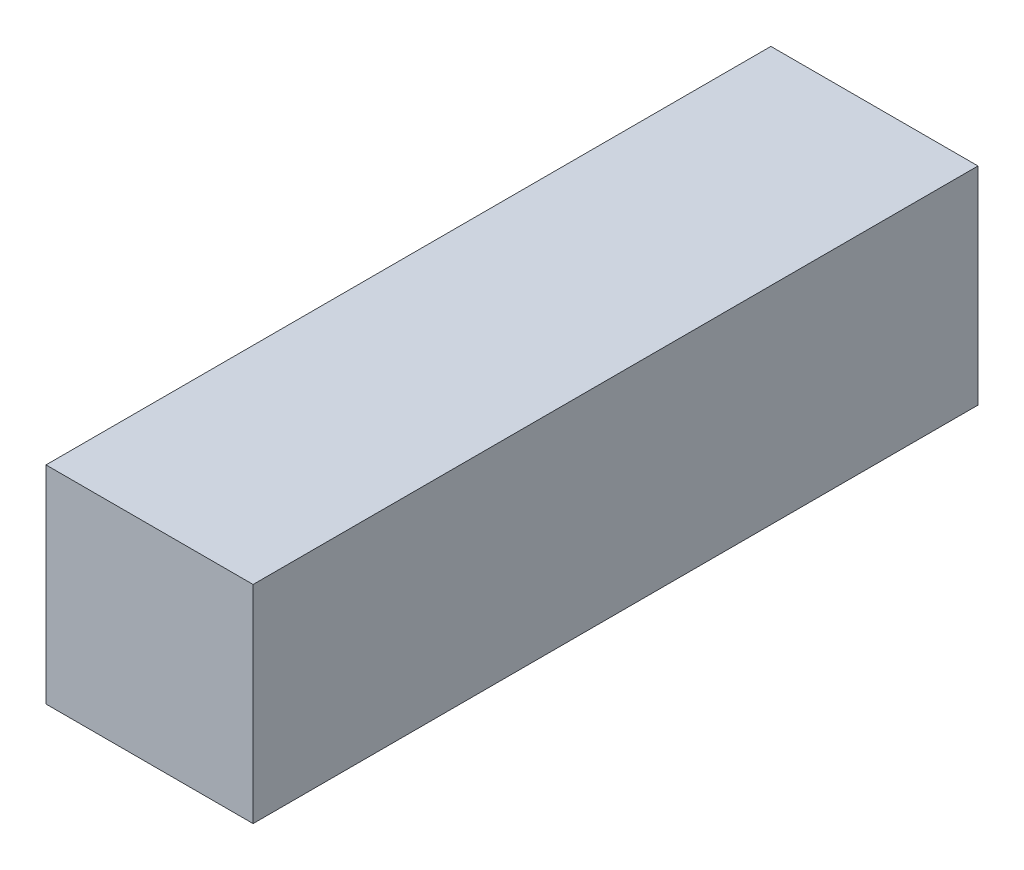
ISO-10303-21;
HEADER;
FILE_DESCRIPTION(('STEP AP214'),'2;1');
FILE_NAME('part.step','',(''),(''),'','','');
FILE_SCHEMA(('AUTOMOTIVE_DESIGN { 1 0 10303 214 1 1 1 1 }'));
ENDSEC;
DATA;
#1=APPLICATION_CONTEXT('core data for automotive mechanical design processes');
#2=APPLICATION_PROTOCOL_DEFINITION('international standard','automotive_design',2000,#1);
#3=PRODUCT_CONTEXT('',#1,'mechanical');
#4=PRODUCT('Part','Part','',(#3));
#5=PRODUCT_RELATED_PRODUCT_CATEGORY('part','',(#4));
#6=PRODUCT_DEFINITION_FORMATION('','',#4);
#7=PRODUCT_DEFINITION_CONTEXT('part definition',#1,'design');
#8=PRODUCT_DEFINITION('design','',#6,#7);
#9=PRODUCT_DEFINITION_SHAPE('','',#8);
#10=(LENGTH_UNIT() NAMED_UNIT(*) SI_UNIT(.MILLI.,.METRE.));
#11=(NAMED_UNIT(*) PLANE_ANGLE_UNIT() SI_UNIT($,.RADIAN.));
#12=(NAMED_UNIT(*) SI_UNIT($,.STERADIAN.) SOLID_ANGLE_UNIT());
#13=UNCERTAINTY_MEASURE_WITH_UNIT(LENGTH_MEASURE(1.E-05),#10,'distance_accuracy_value','');
#14=(GEOMETRIC_REPRESENTATION_CONTEXT(3) GLOBAL_UNCERTAINTY_ASSIGNED_CONTEXT((#13)) GLOBAL_UNIT_ASSIGNED_CONTEXT((#10,
#11,#12)) REPRESENTATION_CONTEXT('',''));
#15=CARTESIAN_POINT('',(0.,0.,0.));
#16=DIRECTION('',(0.,0.,1.));
#17=DIRECTION('',(1.,0.,0.));
#18=AXIS2_PLACEMENT_3D('',#15,#16,#17);
#19=CARTESIAN_POINT('',(2.,-2.,7.));
#20=DIRECTION('',(0.,1.,0.));
#21=DIRECTION('',(-1.,0.,0.));
#22=AXIS2_PLACEMENT_3D('',#19,#20,#21);
#23=PLANE('',#22);
#24=DIRECTION('',(0.,0.,-1.));
#25=VECTOR('',#24,1.);
#26=CARTESIAN_POINT('',(-2.,-2.,7.));
#27=LINE('',#26,#25);
#28=CARTESIAN_POINT('',(-2.,-2.,7.));
#29=VERTEX_POINT('',#28);
#30=CARTESIAN_POINT('',(-2.,-2.,-7.));
#31=VERTEX_POINT('',#30);
#32=EDGE_CURVE('E94',#29,#31,#27,.T.);
#33=ORIENTED_EDGE('',*,*,#32,.T.);
#34=DIRECTION('',(1.,0.,0.));
#35=VECTOR('',#34,1.);
#36=CARTESIAN_POINT('',(2.,-2.,-7.));
#37=LINE('',#36,#35);
#38=CARTESIAN_POINT('',(2.,-2.,-7.));
#39=VERTEX_POINT('',#38);
#40=EDGE_CURVE('E89',#31,#39,#37,.T.);
#41=ORIENTED_EDGE('',*,*,#40,.T.);
#42=DIRECTION('',(0.,0.,-1.));
#43=VECTOR('',#42,1.);
#44=CARTESIAN_POINT('',(2.,-2.,7.));
#45=LINE('',#44,#43);
#46=CARTESIAN_POINT('',(2.,-2.,7.));
#47=VERTEX_POINT('',#46);
#48=EDGE_CURVE('E11',#47,#39,#45,.T.);
#49=ORIENTED_EDGE('',*,*,#48,.F.);
#50=DIRECTION('',(1.,0.,0.));
#51=VECTOR('',#50,1.);
#52=CARTESIAN_POINT('',(2.,-2.,7.));
#53=LINE('',#52,#51);
#54=EDGE_CURVE('E100',#29,#47,#53,.T.);
#55=ORIENTED_EDGE('',*,*,#54,.F.);
#56=EDGE_LOOP('',(#33,#41,#49,#55));
#57=FACE_BOUND('',#56,.T.);
#58=ADVANCED_FACE('F37',(#57),#23,.F.);
#59=CARTESIAN_POINT('',(2.,-2.,7.));
#60=DIRECTION('',(-1.,0.,0.));
#61=DIRECTION('',(0.,-1.,0.));
#62=AXIS2_PLACEMENT_3D('',#59,#60,#61);
#63=PLANE('',#62);
#64=ORIENTED_EDGE('',*,*,#48,.T.);
#65=DIRECTION('',(0.,1.,0.));
#66=VECTOR('',#65,1.);
#67=CARTESIAN_POINT('',(2.,-2.,-7.));
#68=LINE('',#67,#66);
#69=CARTESIAN_POINT('',(2.,2.,-7.));
#70=VERTEX_POINT('',#69);
#71=EDGE_CURVE('E79',#39,#70,#68,.T.);
#72=ORIENTED_EDGE('',*,*,#71,.T.);
#73=DIRECTION('',(0.,0.,-1.));
#74=VECTOR('',#73,1.);
#75=CARTESIAN_POINT('',(2.,2.,7.));
#76=LINE('',#75,#74);
#77=CARTESIAN_POINT('',(2.,2.,7.));
#78=VERTEX_POINT('',#77);
#79=EDGE_CURVE('E44',#78,#70,#76,.T.);
#80=ORIENTED_EDGE('',*,*,#79,.F.);
#81=DIRECTION('',(0.,1.,0.));
#82=VECTOR('',#81,1.);
#83=CARTESIAN_POINT('',(2.,-2.,7.));
#84=LINE('',#83,#82);
#85=EDGE_CURVE('E80',#47,#78,#84,.T.);
#86=ORIENTED_EDGE('',*,*,#85,.F.);
#87=EDGE_LOOP('',(#64,#72,#80,#86));
#88=FACE_BOUND('',#87,.T.);
#89=ADVANCED_FACE('F77',(#88),#63,.F.);
#90=CARTESIAN_POINT('',(2.,2.,7.));
#91=DIRECTION('',(0.,-1.,0.));
#92=DIRECTION('',(1.,0.,0.));
#93=AXIS2_PLACEMENT_3D('',#90,#91,#92);
#94=PLANE('',#93);
#95=ORIENTED_EDGE('',*,*,#79,.T.);
#96=DIRECTION('',(-1.,0.,0.));
#97=VECTOR('',#96,1.);
#98=CARTESIAN_POINT('',(2.,2.,-7.));
#99=LINE('',#98,#97);
#100=CARTESIAN_POINT('',(-2.,2.,-7.));
#101=VERTEX_POINT('',#100);
#102=EDGE_CURVE('E92',#70,#101,#99,.T.);
#103=ORIENTED_EDGE('',*,*,#102,.T.);
#104=DIRECTION('',(0.,0.,-1.));
#105=VECTOR('',#104,1.);
#106=CARTESIAN_POINT('',(-2.,2.,7.));
#107=LINE('',#106,#105);
#108=CARTESIAN_POINT('',(-2.,2.,7.));
#109=VERTEX_POINT('',#108);
#110=EDGE_CURVE('E106',#109,#101,#107,.T.);
#111=ORIENTED_EDGE('',*,*,#110,.F.);
#112=DIRECTION('',(-1.,0.,0.));
#113=VECTOR('',#112,1.);
#114=CARTESIAN_POINT('',(2.,2.,7.));
#115=LINE('',#114,#113);
#116=EDGE_CURVE('E56',#78,#109,#115,.T.);
#117=ORIENTED_EDGE('',*,*,#116,.F.);
#118=EDGE_LOOP('',(#95,#103,#111,#117));
#119=FACE_BOUND('',#118,.T.);
#120=ADVANCED_FACE('F108',(#119),#94,.F.);
#121=CARTESIAN_POINT('',(-2.,-2.,7.));
#122=DIRECTION('',(1.,0.,0.));
#123=DIRECTION('',(0.,0.,-1.));
#124=AXIS2_PLACEMENT_3D('',#121,#122,#123);
#125=PLANE('',#124);
#126=ORIENTED_EDGE('',*,*,#110,.T.);
#127=DIRECTION('',(0.,-1.,0.));
#128=VECTOR('',#127,1.);
#129=CARTESIAN_POINT('',(-2.,-2.,-7.));
#130=LINE('',#129,#128);
#131=EDGE_CURVE('E98',#101,#31,#130,.T.);
#132=ORIENTED_EDGE('',*,*,#131,.T.);
#133=ORIENTED_EDGE('',*,*,#32,.F.);
#134=DIRECTION('',(0.,-1.,0.));
#135=VECTOR('',#134,1.);
#136=CARTESIAN_POINT('',(-2.,-2.,7.));
#137=LINE('',#136,#135);
#138=EDGE_CURVE('E51',#109,#29,#137,.T.);
#139=ORIENTED_EDGE('',*,*,#138,.F.);
#140=EDGE_LOOP('',(#126,#132,#133,#139));
#141=FACE_BOUND('',#140,.T.);
#142=ADVANCED_FACE('F110',(#141),#125,.F.);
#143=CARTESIAN_POINT('',(0.,0.,7.));
#144=DIRECTION('',(0.,0.,-1.));
#145=DIRECTION('',(-1.,0.,0.));
#146=AXIS2_PLACEMENT_3D('',#143,#144,#145);
#147=PLANE('',#146);
#148=ORIENTED_EDGE('',*,*,#54,.T.);
#149=ORIENTED_EDGE('',*,*,#85,.T.);
#150=ORIENTED_EDGE('',*,*,#116,.T.);
#151=ORIENTED_EDGE('',*,*,#138,.T.);
#152=EDGE_LOOP('',(#148,#149,#150,#151));
#153=FACE_BOUND('',#152,.T.);
#154=ADVANCED_FACE('F111',(#153),#147,.F.);
#155=CARTESIAN_POINT('',(0.,0.,-7.));
#156=DIRECTION('',(0.,0.,-1.));
#157=DIRECTION('',(-1.,0.,0.));
#158=AXIS2_PLACEMENT_3D('',#155,#156,#157);
#159=PLANE('',#158);
#160=ORIENTED_EDGE('',*,*,#40,.F.);
#161=ORIENTED_EDGE('',*,*,#131,.F.);
#162=ORIENTED_EDGE('',*,*,#102,.F.);
#163=ORIENTED_EDGE('',*,*,#71,.F.);
#164=EDGE_LOOP('',(#160,#161,#162,#163));
#165=FACE_BOUND('',#164,.T.);
#166=ADVANCED_FACE('F87',(#165),#159,.T.);
#167=CLOSED_SHELL('',(#58,#89,#120,#142,#154,#166));
#168=MANIFOLD_SOLID_BREP('B2',#167);
#169=ADVANCED_BREP_SHAPE_REPRESENTATION('',(#18,#168),#14);
#170=SHAPE_DEFINITION_REPRESENTATION(#9,#169);
ENDSEC;
END-ISO-10303-21;
